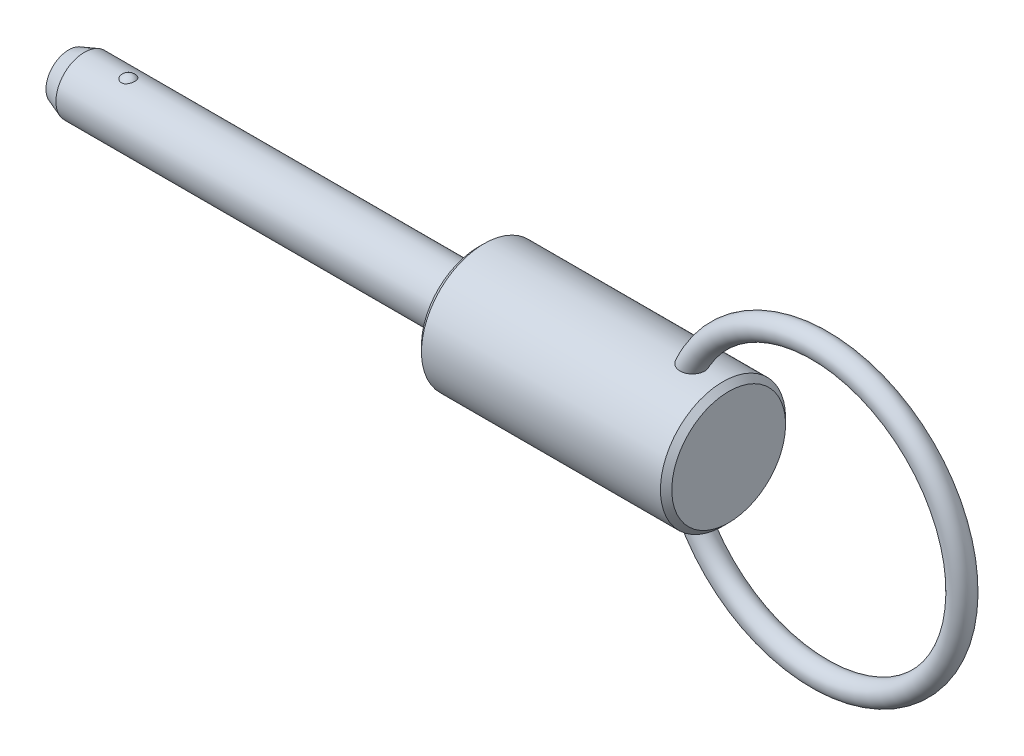
ISO-10303-21;
HEADER;
FILE_DESCRIPTION(('STEP AP214'),'2;1');
FILE_NAME('part.step','',(''),(''),'','','');
FILE_SCHEMA(('AUTOMOTIVE_DESIGN { 1 0 10303 214 1 1 1 1 }'));
ENDSEC;
DATA;
#1=APPLICATION_CONTEXT('core data for automotive mechanical design processes');
#2=APPLICATION_PROTOCOL_DEFINITION('international standard','automotive_design',2000,#1);
#3=PRODUCT_CONTEXT('',#1,'mechanical');
#4=PRODUCT('Part','Part','',(#3));
#5=PRODUCT_RELATED_PRODUCT_CATEGORY('part','',(#4));
#6=PRODUCT_DEFINITION_FORMATION('','',#4);
#7=PRODUCT_DEFINITION_CONTEXT('part definition',#1,'design');
#8=PRODUCT_DEFINITION('design','',#6,#7);
#9=PRODUCT_DEFINITION_SHAPE('','',#8);
#10=(LENGTH_UNIT() NAMED_UNIT(*) SI_UNIT(.MILLI.,.METRE.));
#11=(NAMED_UNIT(*) PLANE_ANGLE_UNIT() SI_UNIT($,.RADIAN.));
#12=(NAMED_UNIT(*) SI_UNIT($,.STERADIAN.) SOLID_ANGLE_UNIT());
#13=UNCERTAINTY_MEASURE_WITH_UNIT(LENGTH_MEASURE(1.E-05),#10,'distance_accuracy_value','');
#14=(GEOMETRIC_REPRESENTATION_CONTEXT(3) GLOBAL_UNCERTAINTY_ASSIGNED_CONTEXT((#13)) GLOBAL_UNIT_ASSIGNED_CONTEXT((#10,
#11,#12)) REPRESENTATION_CONTEXT('',''));
#15=CARTESIAN_POINT('',(0.,0.,0.));
#16=DIRECTION('',(0.,0.,1.));
#17=DIRECTION('',(1.,0.,0.));
#18=AXIS2_PLACEMENT_3D('',#15,#16,#17);
#19=CARTESIAN_POINT('',(-36.,0.,0.));
#20=DIRECTION('',(1.,0.,0.));
#21=DIRECTION('',(0.,0.,-1.));
#22=AXIS2_PLACEMENT_3D('',#19,#20,#21);
#23=PLANE('',#22);
#24=CARTESIAN_POINT('',(-36.,0.,0.));
#25=DIRECTION('',(1.,0.,0.));
#26=DIRECTION('',(0.,0.,-1.));
#27=AXIS2_PLACEMENT_3D('',#24,#25,#26);
#28=CIRCLE('',#27,2.);
#29=CARTESIAN_POINT('',(-36.,0.,-2.));
#30=VERTEX_POINT('',#29);
#31=EDGE_CURVE('E64',#30,#30,#28,.T.);
#32=ORIENTED_EDGE('',*,*,#31,.F.);
#33=EDGE_LOOP('',(#32));
#34=FACE_BOUND('',#33,.T.);
#35=ADVANCED_FACE('F14',(#34),#23,.F.);
#36=CARTESIAN_POINT('',(-36.,0.,0.));
#37=DIRECTION('',(1.,0.,0.));
#38=DIRECTION('',(0.,0.,-1.));
#39=AXIS2_PLACEMENT_3D('',#36,#37,#38);
#40=CONICAL_SURFACE('',#39,2.,0.349065850398864);
#41=CARTESIAN_POINT('',(-34.6262612902727,0.,0.));
#42=DIRECTION('',(1.,0.,0.));
#43=DIRECTION('',(0.,0.,-1.));
#44=AXIS2_PLACEMENT_3D('',#41,#42,#43);
#45=CIRCLE('',#44,2.5);
#46=CARTESIAN_POINT('',(-34.6262612902727,0.,-2.5));
#47=VERTEX_POINT('',#46);
#48=EDGE_CURVE('E84',#47,#47,#45,.T.);
#49=ORIENTED_EDGE('',*,*,#48,.F.);
#50=EDGE_LOOP('',(#49));
#51=FACE_BOUND('',#50,.T.);
#52=ORIENTED_EDGE('',*,*,#31,.T.);
#53=EDGE_LOOP('',(#52));
#54=FACE_BOUND('',#53,.T.);
#55=ADVANCED_FACE('F71',(#51,#54),#40,.T.);
#56=CARTESIAN_POINT('',(22.,0.,0.));
#57=DIRECTION('',(1.,0.,0.));
#58=DIRECTION('',(0.,0.,-1.));
#59=AXIS2_PLACEMENT_3D('',#56,#57,#58);
#60=CYLINDRICAL_SURFACE('',#59,2.5);
#61=CARTESIAN_POINT('',(0.,0.,0.));
#62=DIRECTION('',(1.,0.,0.));
#63=DIRECTION('',(0.,0.,-1.));
#64=AXIS2_PLACEMENT_3D('',#61,#62,#63);
#65=CIRCLE('',#64,2.50000000000001);
#66=CARTESIAN_POINT('',(0.,0.,-2.50000000000001));
#67=VERTEX_POINT('',#66);
#68=EDGE_CURVE('E87',#67,#67,#65,.T.);
#69=ORIENTED_EDGE('',*,*,#68,.F.);
#70=EDGE_LOOP('',(#69));
#71=FACE_BOUND('',#70,.T.);
#72=CARTESIAN_POINT('',(-30.1909824144925,2.50000132180147,0.));
#73=CARTESIAN_POINT('',(-30.190982983277,2.50000074832707,0.0368413823944425));
#74=CARTESIAN_POINT('',(-30.193899595778,2.49917860381728,0.0736949463461856));
#75=CARTESIAN_POINT('',(-30.205545895507,2.49597392437758,0.146421431754274));
#76=CARTESIAN_POINT('',(-30.2142788974873,2.49359049968907,0.182293781875123));
#77=CARTESIAN_POINT('',(-30.2374976130642,2.48750606093943,0.252075941999182));
#78=CARTESIAN_POINT('',(-30.251991507396,2.48380317395774,0.285982882231402));
#79=CARTESIAN_POINT('',(-30.2865652766542,2.47549345809683,0.350709284523071));
#80=CARTESIAN_POINT('',(-30.3066443295174,2.47088676227598,0.381529200045457));
#81=CARTESIAN_POINT('',(-30.3513943275932,2.46147553361513,0.438106598924066));
#82=CARTESIAN_POINT('',(-30.3759104305623,2.45668100135698,0.463987669719915));
#83=CARTESIAN_POINT('',(-30.4294004660062,2.44739311702123,0.510721025805483));
#84=CARTESIAN_POINT('',(-30.458371518322,2.44289957302798,0.531576537952271));
#85=CARTESIAN_POINT('',(-30.5170521820363,2.43524689284402,0.56555136988615));
#86=CARTESIAN_POINT('',(-30.546435448101,2.43200195360591,0.579214186831363));
#87=CARTESIAN_POINT('',(-30.6073131136725,2.42673430292869,0.600905292766169));
#88=CARTESIAN_POINT('',(-30.6388057783101,2.42471060047255,0.60893815124719));
#89=CARTESIAN_POINT('',(-30.6995970588893,2.42230237398913,0.618443451272527));
#90=CARTESIAN_POINT('',(-30.7288011927592,2.42177448257891,0.620490348103578));
#91=CARTESIAN_POINT('',(-30.7871224044137,2.42200721247032,0.619581783080072));
#92=CARTESIAN_POINT('',(-30.8162395040287,2.42276747768197,0.616627703664394));
#93=CARTESIAN_POINT('',(-30.8723141230219,2.4254264251536,0.606080776179144));
#94=CARTESIAN_POINT('',(-30.8993112170762,2.42727703845963,0.598683554349574));
#95=CARTESIAN_POINT('',(-30.9517129407813,2.43187520645511,0.579721920108086));
#96=CARTESIAN_POINT('',(-30.977117400981,2.43462285639399,0.568157065153736));
#97=CARTESIAN_POINT('',(-31.0266944258998,2.44085532302557,0.540767064708474));
#98=CARTESIAN_POINT('',(-31.0507833854669,2.4443642026634,0.524796611246392));
#99=CARTESIAN_POINT('',(-31.0961719617352,2.45170469992017,0.489357864778925));
#100=CARTESIAN_POINT('',(-31.1174706535446,2.45553642386448,0.46988841700612));
#101=CARTESIAN_POINT('',(-31.1587127712632,2.46352076143951,0.426147174209639));
#102=CARTESIAN_POINT('',(-31.1783664876434,2.46767155621149,0.401602088190733));
#103=CARTESIAN_POINT('',(-31.2137089565694,2.47555326850632,0.349748916800856));
#104=CARTESIAN_POINT('',(-31.2293961025171,2.47928401555706,0.32243971811979));
#105=CARTESIAN_POINT('',(-31.2579452506385,2.48632111606385,0.263028320598653));
#106=CARTESIAN_POINT('',(-31.2703924729302,2.48955254187385,0.230717598425573));
#107=CARTESIAN_POINT('',(-31.2902016789596,2.4948049524728,0.164479022684141));
#108=CARTESIAN_POINT('',(-31.2975618970283,2.49682551694661,0.130550611989253));
#109=CARTESIAN_POINT('',(-31.3074516132802,2.49955631207524,0.0596428897504276));
#110=CARTESIAN_POINT('',(-31.3096288805466,2.50017089428436,0.022610342897122));
#111=CARTESIAN_POINT('',(-31.3081099844111,2.49974662692369,-0.0513293524267987));
#112=CARTESIAN_POINT('',(-31.3044126038726,2.4987074347172,-0.0882364733233544));
#113=CARTESIAN_POINT('',(-31.2910280263036,2.49504133320504,-0.16171121773784));
#114=CARTESIAN_POINT('',(-31.2812117218859,2.49238022970867,-0.19825380458634));
#115=CARTESIAN_POINT('',(-31.2555706124758,2.48573447130377,-0.269051260207985));
#116=CARTESIAN_POINT('',(-31.2397457212462,2.48174979739905,-0.303306096138299));
#117=CARTESIAN_POINT('',(-31.2027822705322,2.47304504300688,-0.367520829830575));
#118=CARTESIAN_POINT('',(-31.1817937193082,2.46834695423932,-0.397569711496031));
#119=CARTESIAN_POINT('',(-31.1346567549067,2.45872696762493,-0.453278434783283));
#120=CARTESIAN_POINT('',(-31.1085107270559,2.4538051740481,-0.478940295193746));
#121=CARTESIAN_POINT('',(-31.053880910052,2.44478952032015,-0.522944402436848));
#122=CARTESIAN_POINT('',(-31.025737382929,2.44066103655345,-0.541700853734175));
#123=CARTESIAN_POINT('',(-30.9663314381165,2.43335542807434,-0.573630262390602));
#124=CARTESIAN_POINT('',(-30.9350718068216,2.43017746341114,-0.586808153691956));
#125=CARTESIAN_POINT('',(-30.8739109580175,2.42550489332322,-0.605814984105324));
#126=CARTESIAN_POINT('',(-30.8442158045132,2.42386778550576,-0.612273825415791));
#127=CARTESIAN_POINT('',(-30.784112482874,2.42194073289537,-0.619854334305673));
#128=CARTESIAN_POINT('',(-30.7537046761749,2.42165011945118,-0.620978650945984));
#129=CARTESIAN_POINT('',(-30.6953390069628,2.42242391150241,-0.617951113064523));
#130=CARTESIAN_POINT('',(-30.667359932117,2.42339396580698,-0.61416667945971));
#131=CARTESIAN_POINT('',(-30.6124507001851,2.42641645390674,-0.602114084032708));
#132=CARTESIAN_POINT('',(-30.5855205202131,2.42846886407179,-0.593846020097611));
#133=CARTESIAN_POINT('',(-30.5332039515519,2.43345250762785,-0.573081812804743));
#134=CARTESIAN_POINT('',(-30.50783064439,2.43639021163736,-0.560554448648011));
#135=CARTESIAN_POINT('',(-30.4594022378393,2.44283988853925,-0.531742960501254));
#136=CARTESIAN_POINT('',(-30.4363476983064,2.44635199958462,-0.515457932351985));
#137=CARTESIAN_POINT('',(-30.3913721242442,2.45389274916464,-0.478324263957468));
#138=CARTESIAN_POINT('',(-30.3696589318501,2.45794037916689,-0.457228182109878));
#139=CARTESIAN_POINT('',(-30.3297189578405,2.46593409117001,-0.411943952973079));
#140=CARTESIAN_POINT('',(-30.3114938681236,2.46988012309182,-0.387754314601049));
#141=CARTESIAN_POINT('',(-30.2771403805092,2.47769297234334,-0.334413683606878));
#142=CARTESIAN_POINT('',(-30.261395843791,2.48151362442097,-0.305008674043513));
#143=CARTESIAN_POINT('',(-30.2345681322098,2.4882474177775,-0.244058884268791));
#144=CARTESIAN_POINT('',(-30.2234846973052,2.49116060968098,-0.212514223541994));
#145=CARTESIAN_POINT('',(-30.2068620615398,2.49560906650456,-0.150991952793885));
#146=CARTESIAN_POINT('',(-30.2009111201208,2.49724535759123,-0.121131779318214));
#147=CARTESIAN_POINT('',(-30.1929708188484,2.4994417880429,-0.0608505528772857));
#148=CARTESIAN_POINT('',(-30.1909819447003,2.50000179546719,-0.03042943160735));
#149=CARTESIAN_POINT('',(-30.1909824144925,2.50000132180147,0.));
#150=B_SPLINE_CURVE_WITH_KNOTS('',3,(#72,#73,#74,#75,#76,#77,#78,#79,#80,#81,#82,#83,#84,#85,
#86,#87,#88,#89,#90,#91,#92,#93,#94,#95,#96,#97,#98,#99,#100,#101,#102,#103,#104,#105,#106,#107,
#108,#109,#110,#111,#112,#113,#114,#115,#116,#117,#118,#119,#120,#121,#122,#123,#124,#125,#126,
#127,#128,#129,#130,#131,#132,#133,#134,#135,#136,#137,#138,#139,#140,#141,#142,#143,#144,#145,
#146,#147,#148,#149),.UNSPECIFIED.,.T.,.F.,(4,2,2,2,2,2,2,2,2,2,2,2,2,2,2,2,2,2,2,2,2,2,2,2,2,2,
2,2,2,2,2,2,2,2,2,2,2,2,4),(0.,0.110420858828427,0.22090470025537,0.331545997638802,
0.442171018659509,0.549496111100953,0.656752106528389,0.753909878254609,0.85098870137895,
0.938384281163717,1.02575570580079,1.10953647295153,1.19332613903206,1.28030270163354,
1.36730802185856,1.46206330421445,1.55685690447507,1.66073433475091,1.76464780218616,
1.87544359072151,1.98626233743456,2.09950238077315,2.21274404943056,2.32302012634988,
2.43324531979637,2.53489281715318,2.63645022386997,2.72726527011212,2.81803521396946,
2.90238744783056,2.9867378401789,3.07172035244655,3.15672333434591,3.24797371834836,
3.33926825164414,3.43956352385114,3.53985319987214,3.63104500444511,3.72224798743229),.UNSPECIFIED.);
#151=CARTESIAN_POINT('',(-30.1909824144925,2.50000132180147,0.));
#152=VERTEX_POINT('',#151);
#153=EDGE_CURVE('E26',#152,#152,#150,.T.);
#154=ORIENTED_EDGE('',*,*,#153,.T.);
#155=EDGE_LOOP('',(#154));
#156=FACE_BOUND('',#155,.T.);
#157=CARTESIAN_POINT('',(-31.3090175855075,-2.50000132180147,0.));
#158=CARTESIAN_POINT('',(-31.309017016723,-2.50000074832707,0.0368413823944421));
#159=CARTESIAN_POINT('',(-31.306100404222,-2.49917860381728,0.0736949463461846));
#160=CARTESIAN_POINT('',(-31.294454104493,-2.49597392437758,0.146421431754274));
#161=CARTESIAN_POINT('',(-31.2857211025127,-2.49359049968907,0.182293781875123));
#162=CARTESIAN_POINT('',(-31.2625023869358,-2.48750606093943,0.252075941999185));
#163=CARTESIAN_POINT('',(-31.248008492604,-2.48380317395774,0.285982882231406));
#164=CARTESIAN_POINT('',(-31.2134347233458,-2.47549345809683,0.350709284523074));
#165=CARTESIAN_POINT('',(-31.1933556704826,-2.47088676227598,0.381529200045459));
#166=CARTESIAN_POINT('',(-31.1486056724068,-2.46147553361513,0.438106598924069));
#167=CARTESIAN_POINT('',(-31.1240895694377,-2.45668100135698,0.46398766971992));
#168=CARTESIAN_POINT('',(-31.0705995339938,-2.44739311702123,0.510721025805487));
#169=CARTESIAN_POINT('',(-31.041628481678,-2.44289957302798,0.531576537952274));
#170=CARTESIAN_POINT('',(-30.9829478179637,-2.43524689284402,0.565551369886153));
#171=CARTESIAN_POINT('',(-30.953564551899,-2.43200195360591,0.579214186831367));
#172=CARTESIAN_POINT('',(-30.8926868863275,-2.42673430292869,0.600905292766173));
#173=CARTESIAN_POINT('',(-30.8611942216899,-2.42471060047255,0.608938151247193));
#174=CARTESIAN_POINT('',(-30.8004029411107,-2.42230237398913,0.61844345127253));
#175=CARTESIAN_POINT('',(-30.7711988072408,-2.42177448257891,0.620490348103581));
#176=CARTESIAN_POINT('',(-30.7128775955863,-2.42200721247032,0.619581783080075));
#177=CARTESIAN_POINT('',(-30.6837604959713,-2.42276747768197,0.616627703664396));
#178=CARTESIAN_POINT('',(-30.6276858769781,-2.4254264251536,0.606080776179145));
#179=CARTESIAN_POINT('',(-30.6006887829238,-2.42727703845963,0.598683554349575));
#180=CARTESIAN_POINT('',(-30.5482870592187,-2.43187520645511,0.579721920108087));
#181=CARTESIAN_POINT('',(-30.522882599019,-2.43462285639399,0.568157065153737));
#182=CARTESIAN_POINT('',(-30.4733055741002,-2.44085532302557,0.540767064708476));
#183=CARTESIAN_POINT('',(-30.4492166145331,-2.44436420266339,0.524796611246395));
#184=CARTESIAN_POINT('',(-30.4038280382648,-2.45170469992017,0.489357864778928));
#185=CARTESIAN_POINT('',(-30.3825293464554,-2.45553642386448,0.469888417006124));
#186=CARTESIAN_POINT('',(-30.3412872287368,-2.46352076143951,0.426147174209642));
#187=CARTESIAN_POINT('',(-30.3216335123566,-2.46767155621149,0.401602088190735));
#188=CARTESIAN_POINT('',(-30.2862910434307,-2.47555326850632,0.349748916800857));
#189=CARTESIAN_POINT('',(-30.2706038974829,-2.47928401555706,0.32243971811979));
#190=CARTESIAN_POINT('',(-30.2420547493615,-2.48632111606385,0.263028320598652));
#191=CARTESIAN_POINT('',(-30.2296075270698,-2.48955254187385,0.230717598425572));
#192=CARTESIAN_POINT('',(-30.2097983210404,-2.4948049524728,0.16447902268414));
#193=CARTESIAN_POINT('',(-30.2024381029717,-2.49682551694661,0.130550611989252));
#194=CARTESIAN_POINT('',(-30.1925483867198,-2.49955631207524,0.059642889750427));
#195=CARTESIAN_POINT('',(-30.1903711194535,-2.50017089428436,0.0226103428971208));
#196=CARTESIAN_POINT('',(-30.1918900155889,-2.49974662692369,-0.0513293524268003));
#197=CARTESIAN_POINT('',(-30.1955873961274,-2.4987074347172,-0.0882364733233559));
#198=CARTESIAN_POINT('',(-30.2089719736964,-2.49504133320504,-0.161711217737842));
#199=CARTESIAN_POINT('',(-30.2187882781141,-2.49238022970867,-0.198253804586342));
#200=CARTESIAN_POINT('',(-30.2444293875242,-2.48573447130377,-0.269051260207988));
#201=CARTESIAN_POINT('',(-30.2602542787538,-2.48174979739905,-0.303306096138301));
#202=CARTESIAN_POINT('',(-30.2972177294678,-2.47304504300688,-0.367520829830576));
#203=CARTESIAN_POINT('',(-30.3182062806918,-2.46834695423932,-0.397569711496033));
#204=CARTESIAN_POINT('',(-30.3653432450933,-2.45872696762493,-0.453278434783285));
#205=CARTESIAN_POINT('',(-30.3914892729441,-2.4538051740481,-0.478940295193747));
#206=CARTESIAN_POINT('',(-30.446119089948,-2.44478952032015,-0.522944402436849));
#207=CARTESIAN_POINT('',(-30.474262617071,-2.44066103655345,-0.541700853734176));
#208=CARTESIAN_POINT('',(-30.5336685618835,-2.43335542807434,-0.573630262390603));
#209=CARTESIAN_POINT('',(-30.5649281931784,-2.43017746341114,-0.586808153691958));
#210=CARTESIAN_POINT('',(-30.6260890419825,-2.42550489332322,-0.605814984105327));
#211=CARTESIAN_POINT('',(-30.6557841954868,-2.42386778550576,-0.612273825415793));
#212=CARTESIAN_POINT('',(-30.715887517126,-2.42194073289537,-0.619854334305675));
#213=CARTESIAN_POINT('',(-30.7462953238251,-2.42165011945118,-0.620978650945986));
#214=CARTESIAN_POINT('',(-30.8046609930372,-2.42242391150241,-0.617951113064525));
#215=CARTESIAN_POINT('',(-30.832640067883,-2.42339396580698,-0.614166679459712));
#216=CARTESIAN_POINT('',(-30.8875492998149,-2.42641645390674,-0.602114084032709));
#217=CARTESIAN_POINT('',(-30.9144794797869,-2.42846886407179,-0.593846020097612));
#218=CARTESIAN_POINT('',(-30.9667960484481,-2.43345250762785,-0.573081812804743));
#219=CARTESIAN_POINT('',(-30.99216935561,-2.43639021163736,-0.560554448648012));
#220=CARTESIAN_POINT('',(-31.0405977621607,-2.44283988853925,-0.531742960501255));
#221=CARTESIAN_POINT('',(-31.0636523016936,-2.44635199958462,-0.515457932351985));
#222=CARTESIAN_POINT('',(-31.1086278757558,-2.45389274916464,-0.478324263957468));
#223=CARTESIAN_POINT('',(-31.13034106815,-2.45794037916689,-0.457228182109878));
#224=CARTESIAN_POINT('',(-31.1702810421595,-2.46593409117001,-0.41194395297308));
#225=CARTESIAN_POINT('',(-31.1885061318764,-2.46988012309182,-0.387754314601051));
#226=CARTESIAN_POINT('',(-31.2228596194908,-2.47769297234334,-0.334413683606881));
#227=CARTESIAN_POINT('',(-31.238604156209,-2.48151362442097,-0.305008674043515));
#228=CARTESIAN_POINT('',(-31.2654318677902,-2.4882474177775,-0.244058884268792));
#229=CARTESIAN_POINT('',(-31.2765153026948,-2.49116060968098,-0.212514223541994));
#230=CARTESIAN_POINT('',(-31.2931379384603,-2.49560906650456,-0.150991952793884));
#231=CARTESIAN_POINT('',(-31.2990888798792,-2.49724535759123,-0.121131779318213));
#232=CARTESIAN_POINT('',(-31.3070291811516,-2.4994417880429,-0.0608505528772851));
#233=CARTESIAN_POINT('',(-31.3090180552997,-2.5000017954672,-0.0304294316073497));
#234=CARTESIAN_POINT('',(-31.3090175855075,-2.50000132180147,0.));
#235=B_SPLINE_CURVE_WITH_KNOTS('',3,(#157,#158,#159,#160,#161,#162,#163,#164,#165,#166,#167,
#168,#169,#170,#171,#172,#173,#174,#175,#176,#177,#178,#179,#180,#181,#182,#183,#184,#185,#186,
#187,#188,#189,#190,#191,#192,#193,#194,#195,#196,#197,#198,#199,#200,#201,#202,#203,#204,#205,
#206,#207,#208,#209,#210,#211,#212,#213,#214,#215,#216,#217,#218,#219,#220,#221,#222,#223,#224,
#225,#226,#227,#228,#229,#230,#231,#232,#233,#234),.UNSPECIFIED.,.T.,.F.,(4,2,2,2,2,2,2,2,2,2,2,
2,2,2,2,2,2,2,2,2,2,2,2,2,2,2,2,2,2,2,2,2,2,2,2,2,2,2,4),(0.,0.110420858828426,0.22090470025537,
0.331545997638805,0.442171018659513,0.549496111100962,0.656752106528392,0.75390987825462,
0.850988701378954,0.93838428116372,1.0257557058008,1.10953647295154,1.19332613903206,
1.28030270163354,1.36730802185857,1.46206330421446,1.55685690447508,1.66073433475092,
1.76464780218617,1.87544359072151,1.98626233743457,2.09950238077316,2.21274404943057,
2.32302012634989,2.43324531979637,2.53489281715319,2.63645022386997,2.72726527011213,
2.81803521396947,2.90238744783058,2.98673784017891,3.07172035244657,3.15672333434593,
3.24797371834837,3.33926825164415,3.43956352385115,3.53985319987216,3.63104500444512,
3.7222479874323),.UNSPECIFIED.);
#236=CARTESIAN_POINT('',(-31.3090175855075,-2.50000132180147,0.));
#237=VERTEX_POINT('',#236);
#238=EDGE_CURVE('E30',#237,#237,#235,.T.);
#239=ORIENTED_EDGE('',*,*,#238,.T.);
#240=EDGE_LOOP('',(#239));
#241=FACE_BOUND('',#240,.T.);
#242=ORIENTED_EDGE('',*,*,#48,.T.);
#243=EDGE_LOOP('',(#242));
#244=FACE_BOUND('',#243,.T.);
#245=ADVANCED_FACE('F66',(#71,#156,#241,#244),#60,.T.);
#246=CARTESIAN_POINT('',(0.,2.50000000000001,0.));
#247=DIRECTION('',(1.,0.,0.));
#248=DIRECTION('',(0.,0.,-1.));
#249=AXIS2_PLACEMENT_3D('',#246,#247,#248);
#250=PLANE('',#249);
#251=CARTESIAN_POINT('',(0.,0.,0.));
#252=DIRECTION('',(1.,0.,0.));
#253=DIRECTION('',(0.,0.,-1.));
#254=AXIS2_PLACEMENT_3D('',#251,#252,#253);
#255=CIRCLE('',#254,5.);
#256=CARTESIAN_POINT('',(0.,0.,-5.));
#257=VERTEX_POINT('',#256);
#258=EDGE_CURVE('E90',#257,#257,#255,.T.);
#259=ORIENTED_EDGE('',*,*,#258,.F.);
#260=EDGE_LOOP('',(#259));
#261=FACE_BOUND('',#260,.T.);
#262=ORIENTED_EDGE('',*,*,#68,.T.);
#263=EDGE_LOOP('',(#262));
#264=FACE_BOUND('',#263,.T.);
#265=ADVANCED_FACE('F70',(#261,#264),#250,.F.);
#266=CARTESIAN_POINT('',(0.,0.,0.));
#267=DIRECTION('',(1.,0.,0.));
#268=DIRECTION('',(0.,0.,-1.));
#269=AXIS2_PLACEMENT_3D('',#266,#267,#268);
#270=CONICAL_SURFACE('',#269,5.,0.785398163397448);
#271=CARTESIAN_POINT('',(0.5,0.,0.));
#272=DIRECTION('',(1.,0.,0.));
#273=DIRECTION('',(0.,0.,-1.));
#274=AXIS2_PLACEMENT_3D('',#271,#272,#273);
#275=CIRCLE('',#274,5.50000000000001);
#276=CARTESIAN_POINT('',(0.5,0.,-5.50000000000001));
#277=VERTEX_POINT('',#276);
#278=EDGE_CURVE('E95',#277,#277,#275,.T.);
#279=ORIENTED_EDGE('',*,*,#278,.F.);
#280=EDGE_LOOP('',(#279));
#281=FACE_BOUND('',#280,.T.);
#282=ORIENTED_EDGE('',*,*,#258,.T.);
#283=EDGE_LOOP('',(#282));
#284=FACE_BOUND('',#283,.T.);
#285=ADVANCED_FACE('F112',(#281,#284),#270,.T.);
#286=CARTESIAN_POINT('',(22.,0.,0.));
#287=DIRECTION('',(1.,0.,0.));
#288=DIRECTION('',(0.,0.,-1.));
#289=AXIS2_PLACEMENT_3D('',#286,#287,#288);
#290=CYLINDRICAL_SURFACE('',#289,5.50000000000001);
#291=CARTESIAN_POINT('',(21.5,0.,0.));
#292=DIRECTION('',(1.,0.,0.));
#293=DIRECTION('',(0.,0.,-1.));
#294=AXIS2_PLACEMENT_3D('',#291,#292,#293);
#295=CIRCLE('',#294,5.50000000000001);
#296=CARTESIAN_POINT('',(21.5,0.,-5.50000000000001));
#297=VERTEX_POINT('',#296);
#298=EDGE_CURVE('E98',#297,#297,#295,.T.);
#299=ORIENTED_EDGE('',*,*,#298,.F.);
#300=EDGE_LOOP('',(#299));
#301=FACE_BOUND('',#300,.T.);
#302=CARTESIAN_POINT('',(17.750576124359,5.48634349152937,-0.38734364301544));
#303=CARTESIAN_POINT('',(17.7724494349483,5.48274154866302,-0.438357640137109));
#304=CARTESIAN_POINT('',(17.798668567357,5.4785525524463,-0.487483688327103));
#305=CARTESIAN_POINT('',(17.8590299594161,5.4694756467688,-0.580541854920455));
#306=CARTESIAN_POINT('',(17.8931756825596,5.46458743214665,-0.624471690155701));
#307=CARTESIAN_POINT('',(17.9683099143467,5.45466697302774,-0.70589789342224));
#308=CARTESIAN_POINT('',(18.0092899351852,5.4496349135229,-0.743402125981354));
#309=CARTESIAN_POINT('',(18.0968786737983,5.43996231872068,-0.811162804638974));
#310=CARTESIAN_POINT('',(18.1434871106382,5.4353217639015,-0.841419612258238));
#311=CARTESIAN_POINT('',(18.2421105372392,5.42679822878332,-0.894768686166552));
#312=CARTESIAN_POINT('',(18.2942262946674,5.42293544887474,-0.917677331965627));
#313=CARTESIAN_POINT('',(18.4014435412949,5.4164636995353,-0.955135020489946));
#314=CARTESIAN_POINT('',(18.4565458544062,5.41385507807288,-0.969681743403903));
#315=CARTESIAN_POINT('',(18.5722273435309,5.40995502488563,-0.991220020264031));
#316=CARTESIAN_POINT('',(18.6329205954058,5.40876805092958,-0.99761444233566));
#317=CARTESIAN_POINT('',(18.7545811789755,5.40809020130652,-1.00127963963812));
#318=CARTESIAN_POINT('',(18.8155486054129,5.40859996553908,-0.998546972721703));
#319=CARTESIAN_POINT('',(18.9425436318609,5.41132152718038,-0.983699181838359));
#320=CARTESIAN_POINT('',(19.0084603559652,5.41370003528318,-0.970664275558046));
#321=CARTESIAN_POINT('',(19.1374924418164,5.42002873610976,-0.934675827152841));
#322=CARTESIAN_POINT('',(19.2006052302796,5.42398034070659,-0.91171337333744));
#323=CARTESIAN_POINT('',(19.327290704899,5.43335165529882,-0.854170884119264));
#324=CARTESIAN_POINT('',(19.3905080756305,5.43886248446503,-0.818818253791183));
#325=CARTESIAN_POINT('',(19.5097319710671,5.45046910774747,-0.737606330369384));
#326=CARTESIAN_POINT('',(19.5657458997128,5.45656428981111,-0.691757962147159));
#327=CARTESIAN_POINT('',(19.6560295212159,5.46710170420007,-0.601944176615336));
#328=CARTESIAN_POINT('',(19.6923264561249,5.47159865768816,-0.560021123578729));
#329=CARTESIAN_POINT('',(19.7576306788024,5.4799995738883,-0.470753432652418));
#330=CARTESIAN_POINT('',(19.7866427283685,5.4839039232949,-0.423412365891546));
#331=CARTESIAN_POINT('',(19.835927081516,5.4906936596261,-0.323720807116122));
#332=CARTESIAN_POINT('',(19.85611921474,5.4935696581054,-0.271329441235914));
#333=CARTESIAN_POINT('',(19.8857365745399,5.49783138637197,-0.163530455476579));
#334=CARTESIAN_POINT('',(19.8951749896126,5.49921894148264,-0.108126617736612));
#335=CARTESIAN_POINT('',(19.9018848665892,5.50020403180955,-0.00482993919980251));
#336=CARTESIAN_POINT('',(19.9007490037099,5.50003590642648,0.0429621901150518));
#337=CARTESIAN_POINT('',(19.8901369344187,5.49848232962586,0.137583127917937));
#338=CARTESIAN_POINT('',(19.8806614176962,5.49709697887289,0.184412015738327));
#339=CARTESIAN_POINT('',(19.854625046861,5.49335968722632,0.273699233533154));
#340=CARTESIAN_POINT('',(19.8384007778908,5.49105384986016,0.316259380209258));
#341=CARTESIAN_POINT('',(19.7998050270622,5.48570455304717,0.39842584112971));
#342=CARTESIAN_POINT('',(19.7774319205093,5.48266089867359,0.438031371160288));
#343=CARTESIAN_POINT('',(19.7246002733669,5.47570905278642,0.518079175558995));
#344=CARTESIAN_POINT('',(19.6935087653994,5.47174174648511,0.558096619940841));
#345=CARTESIAN_POINT('',(19.6260404659049,5.4635430635632,0.633350452424869));
#346=CARTESIAN_POINT('',(19.5896605098613,5.45931152970433,0.668583953309771));
#347=CARTESIAN_POINT('',(19.5054126926911,5.45010923035343,0.740166401350183));
#348=CARTESIAN_POINT('',(19.4566695798711,5.44514852439301,0.775487235921069));
#349=CARTESIAN_POINT('',(19.3545753848554,5.4357581882853,0.838783222313806));
#350=CARTESIAN_POINT('',(19.3012210504649,5.43132893830814,0.866753132572306));
#351=CARTESIAN_POINT('',(19.1823928334966,5.42277510469245,0.91886765507821));
#352=CARTESIAN_POINT('',(19.1163340803812,5.41880853756857,0.941714776276455));
#353=CARTESIAN_POINT('',(18.9813138736454,5.41263001804249,0.976601887449956));
#354=CARTESIAN_POINT('',(18.9123512236494,5.41041879642179,0.988637376624974));
#355=CARTESIAN_POINT('',(18.7708041240367,5.40806833955867,1.00142205122411));
#356=CARTESIAN_POINT('',(18.6981786537159,5.40800654244239,1.00174943589848));
#357=CARTESIAN_POINT('',(18.554086364393,5.41030166387512,0.989282346328382));
#358=CARTESIAN_POINT('',(18.4826188712261,5.412657119658,0.97649580779054));
#359=CARTESIAN_POINT('',(18.3492989357993,5.4192784563542,0.939013401920904));
#360=CARTESIAN_POINT('',(18.2871392971181,5.42337109928982,0.915384619576006));
#361=CARTESIAN_POINT('',(18.1684457778527,5.43291458137856,0.856919323326918));
#362=CARTESIAN_POINT('',(18.1119078541874,5.43836443440801,0.822090941516082));
#363=CARTESIAN_POINT('',(18.0122358526942,5.44926060443399,0.746233077641603));
#364=CARTESIAN_POINT('',(17.9683199779696,5.45464880953473,0.706219664470983));
#365=CARTESIAN_POINT('',(17.8883781647286,5.46523880724,0.618942382076453));
#366=CARTESIAN_POINT('',(17.8523493803514,5.47044066651428,0.571681138554509));
#367=CARTESIAN_POINT('',(17.7912551516919,5.47971600676406,0.474300568444975));
#368=CARTESIAN_POINT('',(17.7656720480603,5.48383766525545,0.424509686931923));
#369=CARTESIAN_POINT('',(17.723339024805,5.49085541006646,0.32121942166441));
#370=CARTESIAN_POINT('',(17.7065886067414,5.49375156554094,0.267720247366497));
#371=CARTESIAN_POINT('',(17.6826387583634,5.49794277869324,0.159663117116605));
#372=CARTESIAN_POINT('',(17.6752601541762,5.49926783926482,0.105145903025839));
#373=CARTESIAN_POINT('',(17.6696605518557,5.50027039008781,-0.00435530517894576));
#374=CARTESIAN_POINT('',(17.671435308539,5.49994864410248,-0.0593390711029633));
#375=CARTESIAN_POINT('',(17.683223695835,5.49784986479384,-0.160842726424567));
#376=CARTESIAN_POINT('',(17.6920930646858,5.4962751005022,-0.207503402354855));
#377=CARTESIAN_POINT('',(17.7164479838765,5.49205687897892,-0.299014424335847));
#378=CARTESIAN_POINT('',(17.7319336421921,5.48941340430632,-0.343864740829028));
#379=CARTESIAN_POINT('',(17.750576124359,5.48634349152937,-0.38734364301544));
#380=B_SPLINE_CURVE_WITH_KNOTS('',3,(#302,#303,#304,#305,#306,#307,#308,#309,#310,#311,#312,
#313,#314,#315,#316,#317,#318,#319,#320,#321,#322,#323,#324,#325,#326,#327,#328,#329,#330,#331,
#332,#333,#334,#335,#336,#337,#338,#339,#340,#341,#342,#343,#344,#345,#346,#347,#348,#349,#350,
#351,#352,#353,#354,#355,#356,#357,#358,#359,#360,#361,#362,#363,#364,#365,#366,#367,#368,#369,
#370,#371,#372,#373,#374,#375,#376,#377,#378,#379),.UNSPECIFIED.,.T.,.F.,(4,2,2,2,2,2,2,2,2,2,2,
2,2,2,2,2,2,2,2,2,2,2,2,2,2,2,2,2,2,2,2,2,2,2,2,2,2,2,4),(0.,0.166692790309874,
0.333458553939869,0.500018725735143,0.666570587336684,0.837008167881501,1.00749300937878,
1.18985828364493,1.3722923420541,1.57315286193928,1.77419406447107,1.99107011292631,
2.20772143628454,2.37398171864613,2.54013303966215,2.70776469731569,2.87519054732634,
3.01786049647347,3.16051864792219,3.29678311999867,3.43308363162774,3.58501369105011,
3.73703503992922,3.91754255335467,4.09817843025887,4.30728129482124,4.51647116703155,
4.73319008136538,4.94977792862348,5.14853533689361,5.34714875091841,5.52518843127067,
5.70316376414474,5.87073799533671,6.03830276908696,6.20261323003978,6.36684749326409,
6.50891636950823,6.65098756435652),.UNSPECIFIED.);
#381=CARTESIAN_POINT('',(17.750576124359,5.48634349152937,-0.38734364301544));
#382=VERTEX_POINT('',#381);
#383=EDGE_CURVE('E9',#382,#382,#380,.T.);
#384=ORIENTED_EDGE('',*,*,#383,.T.);
#385=EDGE_LOOP('',(#384));
#386=FACE_BOUND('',#385,.T.);
#387=CARTESIAN_POINT('',(17.750576124359,-5.48634349152937,-0.38734364301544));
#388=CARTESIAN_POINT('',(17.7290939005615,-5.48988067362355,-0.337238017064364));
#389=CARTESIAN_POINT('',(17.7117971832634,-5.49285243876954,-0.285293584579909));
#390=CARTESIAN_POINT('',(17.6860515827026,-5.49733672557057,-0.179186912476447));
#391=CARTESIAN_POINT('',(17.6776042825028,-5.49884898613256,-0.125024277845681));
#392=CARTESIAN_POINT('',(17.6697894284925,-5.50024663797638,-0.0160269600685613));
#393=CARTESIAN_POINT('',(17.6704218079981,-5.50013204120631,0.0388077181391547));
#394=CARTESIAN_POINT('',(17.6807493015172,-5.49828861929241,0.147586956389541));
#395=CARTESIAN_POINT('',(17.6904440853809,-5.49655985295391,0.201531548785809));
#396=CARTESIAN_POINT('',(17.7186237202468,-5.49168090486253,0.306961368776073));
#397=CARTESIAN_POINT('',(17.7371018756274,-5.48853180593185,0.358448436913075));
#398=CARTESIAN_POINT('',(17.7823347958778,-5.48115955372128,0.457561045141235));
#399=CARTESIAN_POINT('',(17.8090893442438,-5.47693642853756,0.505186686203088));
#400=CARTESIAN_POINT('',(17.870247751946,-5.46785878438405,0.595475758009164));
#401=CARTESIAN_POINT('',(17.9046842538725,-5.46300160883842,0.638116793011375));
#402=CARTESIAN_POINT('',(17.9801279083967,-5.45319676996638,0.717100148687873));
#403=CARTESIAN_POINT('',(18.0211352147157,-5.44824910452538,0.753442321961436));
#404=CARTESIAN_POINT('',(18.1093479894352,-5.43868865656998,0.81963959756394));
#405=CARTESIAN_POINT('',(18.1566561661537,-5.43408399444091,0.849358754939975));
#406=CARTESIAN_POINT('',(18.255454428023,-5.42577695359039,0.900904138869716));
#407=CARTESIAN_POINT('',(18.3069452836311,-5.42207474160673,0.922728907206313));
#408=CARTESIAN_POINT('',(18.4153917580249,-5.41574385047403,0.959208735638045));
#409=CARTESIAN_POINT('',(18.4724921126268,-5.41317929339791,0.973443042052851));
#410=CARTESIAN_POINT('',(18.5882265354321,-5.40960458140713,0.993114661229161));
#411=CARTESIAN_POINT('',(18.6468611642454,-5.40859500296672,0.998548711526967));
#412=CARTESIAN_POINT('',(18.7695971039904,-5.40813295729947,1.00105040189851));
#413=CARTESIAN_POINT('',(18.8337148614523,-5.40882901737035,0.997319922295367));
#414=CARTESIAN_POINT('',(18.9606299132457,-5.41193388678035,0.980327713121076));
#415=CARTESIAN_POINT('',(19.0234266102374,-5.41434345447199,0.9670617633786));
#416=CARTESIAN_POINT('',(19.1524350637735,-5.42088180376624,0.929750622340865));
#417=CARTESIAN_POINT('',(19.2183701295968,-5.42515707644054,0.904768928775136));
#418=CARTESIAN_POINT('',(19.3453135258433,-5.43487480967685,0.844433019475008));
#419=CARTESIAN_POINT('',(19.4063166229842,-5.4403184882181,0.809067965569569));
#420=CARTESIAN_POINT('',(19.5228267289755,-5.45185170789624,0.727366108174053));
#421=CARTESIAN_POINT('',(19.5781542083735,-5.45795416644442,0.680772828142778));
#422=CARTESIAN_POINT('',(19.6786861594267,-5.4698197131416,0.57770170170322));
#423=CARTESIAN_POINT('',(19.7239155390489,-5.47558360988991,0.521248802685964));
#424=CARTESIAN_POINT('',(19.7886992637662,-5.48417660555829,0.418978910425003));
#425=CARTESIAN_POINT('',(19.8118482964948,-5.48735700898489,0.375456864586482));
#426=CARTESIAN_POINT('',(19.8506881987874,-5.49278898135121,0.285144410886741));
#427=CARTESIAN_POINT('',(19.8663862346913,-5.49504144250568,0.2383571933497));
#428=CARTESIAN_POINT('',(19.8893740183894,-5.4983656270033,0.142432814707224));
#429=CARTESIAN_POINT('',(19.896619115609,-5.49943107893956,0.0932845898476243));
#430=CARTESIAN_POINT('',(19.9019867294569,-5.50021880874901,-0.00552155763542596));
#431=CARTESIAN_POINT('',(19.9001110284886,-5.49994134905654,-0.0551793787799884));
#432=CARTESIAN_POINT('',(19.8879335658766,-5.49816110600741,-0.149168594802946));
#433=CARTESIAN_POINT('',(19.8783500883967,-5.49676280891227,-0.193597964463579));
#434=CARTESIAN_POINT('',(19.8522631697708,-5.49302342283862,-0.280320363305109));
#435=CARTESIAN_POINT('',(19.8357584528019,-5.4906821600422,-0.322612997000643));
#436=CARTESIAN_POINT('',(19.7957322794172,-5.48514667862487,-0.40621176399712));
#437=CARTESIAN_POINT('',(19.7719079923134,-5.48191644382045,-0.447369304587104));
#438=CARTESIAN_POINT('',(19.7186530262389,-5.47494950425796,-0.525815466490565));
#439=CARTESIAN_POINT('',(19.6892198111763,-5.47121257061599,-0.56310232583871));
#440=CARTESIAN_POINT('',(19.6204722397595,-5.46287637009337,-0.639284361219789));
#441=CARTESIAN_POINT('',(19.5803287542718,-5.45823669884499,-0.67742567222604));
#442=CARTESIAN_POINT('',(19.4950767663145,-5.44905653917178,-0.747689839776356));
#443=CARTESIAN_POINT('',(19.44996489947,-5.44451612048116,-0.779808577820476));
#444=CARTESIAN_POINT('',(19.3471402361979,-5.43509397783066,-0.843186972637576));
#445=CARTESIAN_POINT('',(19.2886403121554,-5.43030453790823,-0.873188153013841));
#446=CARTESIAN_POINT('',(19.1677022978459,-5.42187772002936,-0.924070939256887));
#447=CARTESIAN_POINT('',(19.1052616249292,-5.41824110720322,-0.944946491920879));
#448=CARTESIAN_POINT('',(18.9714409415205,-5.41225272326247,-0.978697766681169));
#449=CARTESIAN_POINT('',(18.8997933356931,-5.41006688847914,-0.990558179302096));
#450=CARTESIAN_POINT('',(18.7554670078808,-5.40799041514769,-1.00183640377162));
#451=CARTESIAN_POINT('',(18.6827884229944,-5.40809947423372,-1.00125585479031));
#452=CARTESIAN_POINT('',(18.541312374092,-5.41068728880082,-0.98717394016315));
#453=CARTESIAN_POINT('',(18.4724688324704,-5.41308158098857,-0.974133094450057));
#454=CARTESIAN_POINT('',(18.3385202617556,-5.41990298336526,-0.935433731565717));
#455=CARTESIAN_POINT('',(18.2734123932337,-5.42432852597249,-0.909784943270458));
#456=CARTESIAN_POINT('',(18.1562512748909,-5.43406792126327,-0.849544617381937));
#457=CARTESIAN_POINT('',(18.1035461388546,-5.43923706153865,-0.816195703376568));
#458=CARTESIAN_POINT('',(18.0052305587909,-5.45007243639889,-0.740383462262362));
#459=CARTESIAN_POINT('',(17.9596145131164,-5.45573827291032,-0.697927395230348));
#460=CARTESIAN_POINT('',(17.8836190698721,-5.46593949079551,-0.612419308770543));
#461=CARTESIAN_POINT('',(17.8519731415557,-5.4705135108706,-0.570489737872278));
#462=CARTESIAN_POINT('',(17.795786417966,-5.4790138846105,-0.482054711087679));
#463=CARTESIAN_POINT('',(17.7712441471855,-5.48294037270178,-0.435550208157469));
#464=CARTESIAN_POINT('',(17.750576124359,-5.48634349152937,-0.38734364301544));
#465=B_SPLINE_CURVE_WITH_KNOTS('',3,(#387,#388,#389,#390,#391,#392,#393,#394,#395,#396,#397,
#398,#399,#400,#401,#402,#403,#404,#405,#406,#407,#408,#409,#410,#411,#412,#413,#414,#415,#416,
#417,#418,#419,#420,#421,#422,#423,#424,#425,#426,#427,#428,#429,#430,#431,#432,#433,#434,#435,
#436,#437,#438,#439,#440,#441,#442,#443,#444,#445,#446,#447,#448,#449,#450,#451,#452,#453,#454,
#455,#456,#457,#458,#459,#460,#461,#462,#463,#464),.UNSPECIFIED.,.T.,.F.,(4,2,2,2,2,2,2,2,2,2,2,
2,2,2,2,2,2,2,2,2,2,2,2,2,2,2,2,2,2,2,2,2,2,2,2,2,2,2,4),(0.,0.163706911607204,
0.327443103574007,0.491178093015704,0.654907117708892,0.818511530368836,0.982111663631031,
1.14642068596746,1.31073355280797,1.47815940452212,1.64561616663548,1.82158348952813,
1.99761603276048,2.18951273287958,2.38149441422854,2.59246761145192,2.80366181056893,
3.020234391944,3.23626672419296,3.38387150778108,3.53133403653721,3.67957202301345,
3.82778104171061,3.96358696134323,4.09941792569635,4.24187037655342,4.38438739115565,
4.55047430201398,4.71667437945468,4.91362515618517,5.11070637661546,5.32760198680863,
5.54446901990128,5.75361888099531,5.96260760506036,6.14934910144963,6.33594228010391,
6.49347725687271,6.65097948838457),.UNSPECIFIED.);
#466=CARTESIAN_POINT('',(17.750576124359,-5.48634349152937,-0.38734364301544));
#467=VERTEX_POINT('',#466);
#468=EDGE_CURVE('E17',#467,#467,#465,.T.);
#469=ORIENTED_EDGE('',*,*,#468,.T.);
#470=EDGE_LOOP('',(#469));
#471=FACE_BOUND('',#470,.T.);
#472=ORIENTED_EDGE('',*,*,#278,.T.);
#473=EDGE_LOOP('',(#472));
#474=FACE_BOUND('',#473,.T.);
#475=ADVANCED_FACE('F41',(#301,#386,#471,#474),#290,.T.);
#476=CARTESIAN_POINT('',(21.5,0.,0.));
#477=DIRECTION('',(-1.,0.,0.));
#478=DIRECTION('',(0.,0.,1.));
#479=AXIS2_PLACEMENT_3D('',#476,#477,#478);
#480=CONICAL_SURFACE('',#479,5.50000000000001,0.785398163397448);
#481=CARTESIAN_POINT('',(22.,0.,0.));
#482=DIRECTION('',(1.,0.,0.));
#483=DIRECTION('',(0.,0.,-1.));
#484=AXIS2_PLACEMENT_3D('',#481,#482,#483);
#485=CIRCLE('',#484,5.00000000000001);
#486=CARTESIAN_POINT('',(22.,0.,-5.00000000000001));
#487=VERTEX_POINT('',#486);
#488=EDGE_CURVE('E101',#487,#487,#485,.T.);
#489=ORIENTED_EDGE('',*,*,#488,.F.);
#490=EDGE_LOOP('',(#489));
#491=FACE_BOUND('',#490,.T.);
#492=ORIENTED_EDGE('',*,*,#298,.T.);
#493=EDGE_LOOP('',(#492));
#494=FACE_BOUND('',#493,.T.);
#495=ADVANCED_FACE('F111',(#491,#494),#480,.T.);
#496=CARTESIAN_POINT('',(22.,5.00000000000001,0.));
#497=DIRECTION('',(-1.,0.,0.));
#498=DIRECTION('',(0.,0.,1.));
#499=AXIS2_PLACEMENT_3D('',#496,#497,#498);
#500=PLANE('',#499);
#501=ORIENTED_EDGE('',*,*,#488,.T.);
#502=EDGE_LOOP('',(#501));
#503=FACE_BOUND('',#502,.T.);
#504=ADVANCED_FACE('F55',(#503),#500,.F.);
#505=CARTESIAN_POINT('',(-30.75,-2.,0.));
#506=DIRECTION('',(0.,-1.,0.));
#507=DIRECTION('',(1.,0.,0.));
#508=AXIS2_PLACEMENT_3D('',#505,#506,#507);
#509=SPHERICAL_SURFACE('',#508,0.750000000000004);
#510=ORIENTED_EDGE('',*,*,#238,.F.);
#511=EDGE_LOOP('',(#510));
#512=FACE_BOUND('',#511,.T.);
#513=ADVANCED_FACE('F51',(#512),#509,.T.);
#514=CARTESIAN_POINT('',(-30.75,2.,0.));
#515=DIRECTION('',(0.,-1.,0.));
#516=DIRECTION('',(1.,0.,0.));
#517=AXIS2_PLACEMENT_3D('',#514,#515,#516);
#518=SPHERICAL_SURFACE('',#517,0.750000000000002);
#519=ORIENTED_EDGE('',*,*,#153,.F.);
#520=EDGE_LOOP('',(#519));
#521=FACE_BOUND('',#520,.T.);
#522=ADVANCED_FACE('F49',(#521),#518,.T.);
#523=CARTESIAN_POINT('',(30.,0.,0.));
#524=DIRECTION('',(0.,0.,-1.));
#525=DIRECTION('',(-1.,0.,0.));
#526=AXIS2_PLACEMENT_3D('',#523,#524,#525);
#527=TOROIDAL_SURFACE('',#526,12.5,1.);
#528=ORIENTED_EDGE('',*,*,#383,.F.);
#529=EDGE_LOOP('',(#528));
#530=FACE_BOUND('',#529,.T.);
#531=ORIENTED_EDGE('',*,*,#468,.F.);
#532=EDGE_LOOP('',(#531));
#533=FACE_BOUND('',#532,.T.);
#534=ADVANCED_FACE('F45',(#530,#533),#527,.T.);
#535=CLOSED_SHELL('',(#35,#55,#245,#265,#285,#475,#495,#504,#513,#522,#534));
#536=MANIFOLD_SOLID_BREP('B1',#535);
#537=ADVANCED_BREP_SHAPE_REPRESENTATION('',(#18,#536),#14);
#538=SHAPE_DEFINITION_REPRESENTATION(#9,#537);
ENDSEC;
END-ISO-10303-21;
